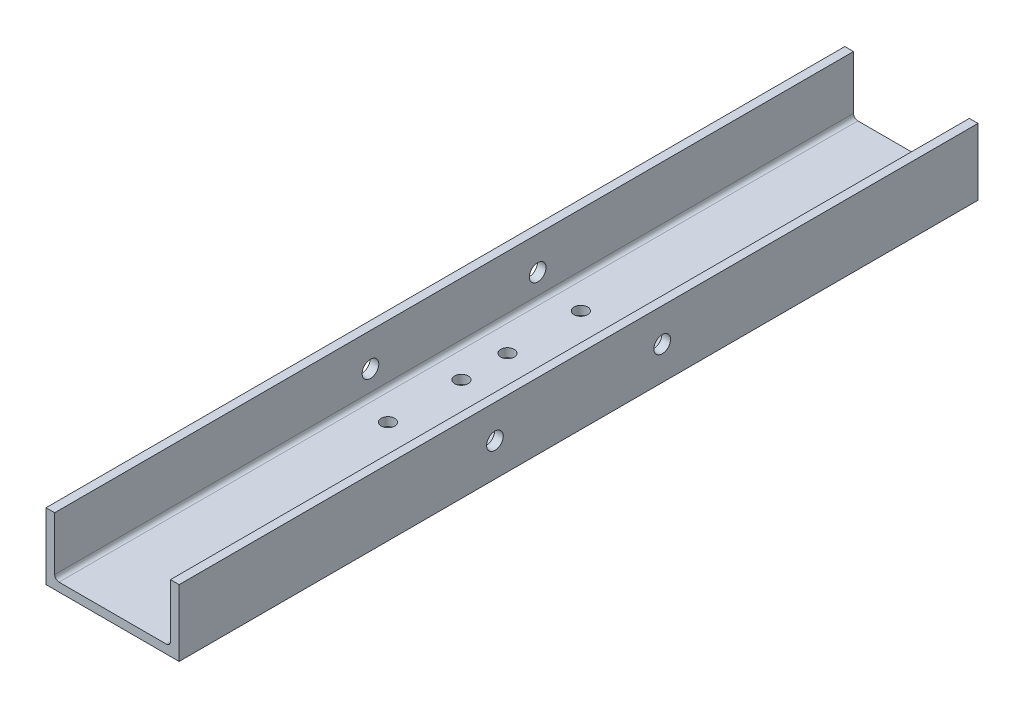
ISO-10303-21;
HEADER;
FILE_DESCRIPTION(('STEP AP214'),'2;1');
FILE_NAME('part.step','',(''),(''),'','','');
FILE_SCHEMA(('AUTOMOTIVE_DESIGN { 1 0 10303 214 1 1 1 1 }'));
ENDSEC;
DATA;
#1=APPLICATION_CONTEXT('core data for automotive mechanical design processes');
#2=APPLICATION_PROTOCOL_DEFINITION('international standard','automotive_design',2000,#1);
#3=PRODUCT_CONTEXT('',#1,'mechanical');
#4=PRODUCT('Part','Part','',(#3));
#5=PRODUCT_RELATED_PRODUCT_CATEGORY('part','',(#4));
#6=PRODUCT_DEFINITION_FORMATION('','',#4);
#7=PRODUCT_DEFINITION_CONTEXT('part definition',#1,'design');
#8=PRODUCT_DEFINITION('design','',#6,#7);
#9=PRODUCT_DEFINITION_SHAPE('','',#8);
#10=(LENGTH_UNIT() NAMED_UNIT(*) SI_UNIT(.MILLI.,.METRE.));
#11=(NAMED_UNIT(*) PLANE_ANGLE_UNIT() SI_UNIT($,.RADIAN.));
#12=(NAMED_UNIT(*) SI_UNIT($,.STERADIAN.) SOLID_ANGLE_UNIT());
#13=UNCERTAINTY_MEASURE_WITH_UNIT(LENGTH_MEASURE(1.E-05),#10,'distance_accuracy_value','');
#14=(GEOMETRIC_REPRESENTATION_CONTEXT(3) GLOBAL_UNCERTAINTY_ASSIGNED_CONTEXT((#13)) GLOBAL_UNIT_ASSIGNED_CONTEXT((#10,
#11,#12)) REPRESENTATION_CONTEXT('',''));
#15=CARTESIAN_POINT('',(0.,0.,0.));
#16=DIRECTION('',(0.,0.,1.));
#17=DIRECTION('',(1.,0.,0.));
#18=AXIS2_PLACEMENT_3D('',#15,#16,#17);
#19=CARTESIAN_POINT('',(-22.098,12.7,152.4));
#20=DIRECTION('',(0.,-1.,0.));
#21=DIRECTION('',(1.,0.,0.));
#22=AXIS2_PLACEMENT_3D('',#19,#20,#21);
#23=PLANE('',#22);
#24=DIRECTION('',(-1.,0.,0.));
#25=VECTOR('',#24,1.);
#26=CARTESIAN_POINT('',(-22.098,12.7,-152.4));
#27=LINE('',#26,#25);
#28=CARTESIAN_POINT('',(-22.098,12.7,-152.4));
#29=VERTEX_POINT('',#28);
#30=CARTESIAN_POINT('',(-25.4,12.7,-152.4));
#31=VERTEX_POINT('',#30);
#32=EDGE_CURVE('E142',#29,#31,#27,.T.);
#33=ORIENTED_EDGE('',*,*,#32,.T.);
#34=DIRECTION('',(0.,0.,-1.));
#35=VECTOR('',#34,1.);
#36=CARTESIAN_POINT('',(-25.4,12.7,152.4));
#37=LINE('',#36,#35);
#38=CARTESIAN_POINT('',(-25.4,12.7,152.4));
#39=VERTEX_POINT('',#38);
#40=EDGE_CURVE('E125',#39,#31,#37,.T.);
#41=ORIENTED_EDGE('',*,*,#40,.F.);
#42=DIRECTION('',(-1.,0.,0.));
#43=VECTOR('',#42,1.);
#44=CARTESIAN_POINT('',(-22.098,12.7,152.4));
#45=LINE('',#44,#43);
#46=CARTESIAN_POINT('',(-22.098,12.7,152.4));
#47=VERTEX_POINT('',#46);
#48=EDGE_CURVE('E131',#47,#39,#45,.T.);
#49=ORIENTED_EDGE('',*,*,#48,.F.);
#50=DIRECTION('',(0.,0.,-1.));
#51=VECTOR('',#50,1.);
#52=CARTESIAN_POINT('',(-22.098,12.7,152.4));
#53=LINE('',#52,#51);
#54=EDGE_CURVE('E245',#47,#29,#53,.T.);
#55=ORIENTED_EDGE('',*,*,#54,.T.);
#56=EDGE_LOOP('',(#33,#41,#49,#55));
#57=FACE_BOUND('',#56,.T.);
#58=ADVANCED_FACE('F43',(#57),#23,.F.);
#59=CARTESIAN_POINT('',(-25.4,12.7,152.4));
#60=DIRECTION('',(1.,0.,0.));
#61=DIRECTION('',(0.,1.,0.));
#62=AXIS2_PLACEMENT_3D('',#59,#60,#61);
#63=PLANE('',#62);
#64=CARTESIAN_POINT('',(-25.4,0.,31.91));
#65=DIRECTION('',(1.,0.,0.));
#66=DIRECTION('',(0.,1.,0.));
#67=AXIS2_PLACEMENT_3D('',#64,#65,#66);
#68=CIRCLE('',#67,3.18);
#69=CARTESIAN_POINT('',(-25.4,3.18,31.91));
#70=VERTEX_POINT('',#69);
#71=EDGE_CURVE('E183',#70,#70,#68,.T.);
#72=ORIENTED_EDGE('',*,*,#71,.T.);
#73=EDGE_LOOP('',(#72));
#74=FACE_BOUND('',#73,.T.);
#75=CARTESIAN_POINT('',(-25.4,0.,-31.91));
#76=DIRECTION('',(1.,0.,0.));
#77=DIRECTION('',(0.,1.,0.));
#78=AXIS2_PLACEMENT_3D('',#75,#76,#77);
#79=CIRCLE('',#78,3.18);
#80=CARTESIAN_POINT('',(-25.4,3.18000000000001,-31.91));
#81=VERTEX_POINT('',#80);
#82=EDGE_CURVE('E172',#81,#81,#79,.T.);
#83=ORIENTED_EDGE('',*,*,#82,.T.);
#84=EDGE_LOOP('',(#83));
#85=FACE_BOUND('',#84,.T.);
#86=DIRECTION('',(0.,-1.,0.));
#87=VECTOR('',#86,1.);
#88=CARTESIAN_POINT('',(-25.4,12.7,-152.4));
#89=LINE('',#88,#87);
#90=CARTESIAN_POINT('',(-25.4,-12.7,-152.4));
#91=VERTEX_POINT('',#90);
#92=EDGE_CURVE('E247',#31,#91,#89,.T.);
#93=ORIENTED_EDGE('',*,*,#92,.T.);
#94=DIRECTION('',(0.,0.,-1.));
#95=VECTOR('',#94,1.);
#96=CARTESIAN_POINT('',(-25.4,-12.7,152.4));
#97=LINE('',#96,#95);
#98=CARTESIAN_POINT('',(-25.4,-12.7,152.4));
#99=VERTEX_POINT('',#98);
#100=EDGE_CURVE('E128',#99,#91,#97,.T.);
#101=ORIENTED_EDGE('',*,*,#100,.F.);
#102=DIRECTION('',(0.,-1.,0.));
#103=VECTOR('',#102,1.);
#104=CARTESIAN_POINT('',(-25.4,12.7,152.4));
#105=LINE('',#104,#103);
#106=EDGE_CURVE('E121',#39,#99,#105,.T.);
#107=ORIENTED_EDGE('',*,*,#106,.F.);
#108=ORIENTED_EDGE('',*,*,#40,.T.);
#109=EDGE_LOOP('',(#93,#101,#107,#108));
#110=FACE_BOUND('',#109,.T.);
#111=ADVANCED_FACE('F123',(#74,#85,#110),#63,.F.);
#112=CARTESIAN_POINT('',(-25.4,-12.7,152.4));
#113=DIRECTION('',(0.,1.,0.));
#114=DIRECTION('',(-1.,0.,0.));
#115=AXIS2_PLACEMENT_3D('',#112,#113,#114);
#116=PLANE('',#115);
#117=CARTESIAN_POINT('',(-10.5304351416879,-12.7,36.79));
#118=DIRECTION('',(0.,1.,0.));
#119=DIRECTION('',(-1.,0.,0.));
#120=AXIS2_PLACEMENT_3D('',#117,#118,#119);
#121=CIRCLE('',#120,2.58499999999999);
#122=CARTESIAN_POINT('',(-13.1154351416879,-12.7,36.79));
#123=VERTEX_POINT('',#122);
#124=EDGE_CURVE('E231',#123,#123,#121,.T.);
#125=ORIENTED_EDGE('',*,*,#124,.T.);
#126=EDGE_LOOP('',(#125));
#127=FACE_BOUND('',#126,.T.);
#128=CARTESIAN_POINT('',(10.4695648583121,-12.7,-36.79));
#129=DIRECTION('',(0.,1.,0.));
#130=DIRECTION('',(-1.,0.,0.));
#131=AXIS2_PLACEMENT_3D('',#128,#129,#130);
#132=CIRCLE('',#131,2.58499999999999);
#133=CARTESIAN_POINT('',(7.88456485831209,-12.7,-36.79));
#134=VERTEX_POINT('',#133);
#135=EDGE_CURVE('E228',#134,#134,#132,.T.);
#136=ORIENTED_EDGE('',*,*,#135,.T.);
#137=EDGE_LOOP('',(#136));
#138=FACE_BOUND('',#137,.T.);
#139=CARTESIAN_POINT('',(-10.5304351416879,-12.7,-36.79));
#140=DIRECTION('',(0.,1.,0.));
#141=DIRECTION('',(-1.,0.,0.));
#142=AXIS2_PLACEMENT_3D('',#139,#140,#141);
#143=CIRCLE('',#142,2.58499999999999);
#144=CARTESIAN_POINT('',(-13.1154351416879,-12.7,-36.79));
#145=VERTEX_POINT('',#144);
#146=EDGE_CURVE('E225',#145,#145,#143,.T.);
#147=ORIENTED_EDGE('',*,*,#146,.T.);
#148=EDGE_LOOP('',(#147));
#149=FACE_BOUND('',#148,.T.);
#150=CARTESIAN_POINT('',(10.4695648583121,-12.7,-8.78999999999999));
#151=DIRECTION('',(0.,1.,0.));
#152=DIRECTION('',(-1.,0.,0.));
#153=AXIS2_PLACEMENT_3D('',#150,#151,#152);
#154=CIRCLE('',#153,2.58499999999999);
#155=CARTESIAN_POINT('',(7.88456485831208,-12.7,-8.78999999999999));
#156=VERTEX_POINT('',#155);
#157=EDGE_CURVE('E222',#156,#156,#154,.T.);
#158=ORIENTED_EDGE('',*,*,#157,.T.);
#159=EDGE_LOOP('',(#158));
#160=FACE_BOUND('',#159,.T.);
#161=CARTESIAN_POINT('',(10.4695648583121,-12.7,36.79));
#162=DIRECTION('',(0.,1.,0.));
#163=DIRECTION('',(-1.,0.,0.));
#164=AXIS2_PLACEMENT_3D('',#161,#162,#163);
#165=CIRCLE('',#164,2.58499999999999);
#166=CARTESIAN_POINT('',(7.88456485831209,-12.7,36.79));
#167=VERTEX_POINT('',#166);
#168=EDGE_CURVE('E219',#167,#167,#165,.T.);
#169=ORIENTED_EDGE('',*,*,#168,.T.);
#170=EDGE_LOOP('',(#169));
#171=FACE_BOUND('',#170,.T.);
#172=CARTESIAN_POINT('',(10.4695648583121,-12.7,8.78999999999999));
#173=DIRECTION('',(0.,1.,0.));
#174=DIRECTION('',(-1.,0.,0.));
#175=AXIS2_PLACEMENT_3D('',#172,#173,#174);
#176=CIRCLE('',#175,2.58499999999999);
#177=CARTESIAN_POINT('',(7.88456485831208,-12.7,8.78999999999999));
#178=VERTEX_POINT('',#177);
#179=EDGE_CURVE('E216',#178,#178,#176,.T.);
#180=ORIENTED_EDGE('',*,*,#179,.T.);
#181=EDGE_LOOP('',(#180));
#182=FACE_BOUND('',#181,.T.);
#183=CARTESIAN_POINT('',(-10.5304351416879,-12.7,8.79));
#184=DIRECTION('',(0.,1.,0.));
#185=DIRECTION('',(-1.,0.,0.));
#186=AXIS2_PLACEMENT_3D('',#183,#184,#185);
#187=CIRCLE('',#186,2.58499999999998);
#188=CARTESIAN_POINT('',(-13.1154351416879,-12.7,8.79));
#189=VERTEX_POINT('',#188);
#190=EDGE_CURVE('E213',#189,#189,#187,.T.);
#191=ORIENTED_EDGE('',*,*,#190,.T.);
#192=EDGE_LOOP('',(#191));
#193=FACE_BOUND('',#192,.T.);
#194=CARTESIAN_POINT('',(-10.5304351416879,-12.7,-8.79));
#195=DIRECTION('',(0.,1.,0.));
#196=DIRECTION('',(-1.,0.,0.));
#197=AXIS2_PLACEMENT_3D('',#194,#195,#196);
#198=CIRCLE('',#197,2.58499999999998);
#199=CARTESIAN_POINT('',(-13.1154351416879,-12.7,-8.79));
#200=VERTEX_POINT('',#199);
#201=EDGE_CURVE('E210',#200,#200,#198,.T.);
#202=ORIENTED_EDGE('',*,*,#201,.T.);
#203=EDGE_LOOP('',(#202));
#204=FACE_BOUND('',#203,.T.);
#205=DIRECTION('',(1.,0.,0.));
#206=VECTOR('',#205,1.);
#207=CARTESIAN_POINT('',(-25.4,-12.7,-152.4));
#208=LINE('',#207,#206);
#209=CARTESIAN_POINT('',(25.4,-12.7,-152.4));
#210=VERTEX_POINT('',#209);
#211=EDGE_CURVE('E249',#91,#210,#208,.T.);
#212=ORIENTED_EDGE('',*,*,#211,.T.);
#213=DIRECTION('',(0.,0.,-1.));
#214=VECTOR('',#213,1.);
#215=CARTESIAN_POINT('',(25.4,-12.7,152.4));
#216=LINE('',#215,#214);
#217=CARTESIAN_POINT('',(25.4,-12.7,152.4));
#218=VERTEX_POINT('',#217);
#219=EDGE_CURVE('E147',#218,#210,#216,.T.);
#220=ORIENTED_EDGE('',*,*,#219,.F.);
#221=DIRECTION('',(1.,0.,0.));
#222=VECTOR('',#221,1.);
#223=CARTESIAN_POINT('',(-25.4,-12.7,152.4));
#224=LINE('',#223,#222);
#225=EDGE_CURVE('E130',#99,#218,#224,.T.);
#226=ORIENTED_EDGE('',*,*,#225,.F.);
#227=ORIENTED_EDGE('',*,*,#100,.T.);
#228=EDGE_LOOP('',(#212,#220,#226,#227));
#229=FACE_BOUND('',#228,.T.);
#230=ADVANCED_FACE('F316',(#127,#138,#149,#160,#171,#182,#193,#204,#229),#116,.F.);
#231=CARTESIAN_POINT('',(25.4,-12.7,152.4));
#232=DIRECTION('',(-1.,0.,0.));
#233=DIRECTION('',(0.,-1.,0.));
#234=AXIS2_PLACEMENT_3D('',#231,#232,#233);
#235=PLANE('',#234);
#236=CARTESIAN_POINT('',(25.4,0.,31.91));
#237=DIRECTION('',(-1.,0.,0.));
#238=DIRECTION('',(0.,-1.,0.));
#239=AXIS2_PLACEMENT_3D('',#236,#237,#238);
#240=CIRCLE('',#239,3.18);
#241=CARTESIAN_POINT('',(25.4,-3.18000000000001,31.91));
#242=VERTEX_POINT('',#241);
#243=EDGE_CURVE('E180',#242,#242,#240,.T.);
#244=ORIENTED_EDGE('',*,*,#243,.T.);
#245=EDGE_LOOP('',(#244));
#246=FACE_BOUND('',#245,.T.);
#247=CARTESIAN_POINT('',(25.4,0.,-31.91));
#248=DIRECTION('',(-1.,0.,0.));
#249=DIRECTION('',(0.,-1.,0.));
#250=AXIS2_PLACEMENT_3D('',#247,#248,#249);
#251=CIRCLE('',#250,3.18);
#252=CARTESIAN_POINT('',(25.4,-3.18,-31.91));
#253=VERTEX_POINT('',#252);
#254=EDGE_CURVE('E167',#253,#253,#251,.T.);
#255=ORIENTED_EDGE('',*,*,#254,.T.);
#256=EDGE_LOOP('',(#255));
#257=FACE_BOUND('',#256,.T.);
#258=DIRECTION('',(0.,1.,0.));
#259=VECTOR('',#258,1.);
#260=CARTESIAN_POINT('',(25.4,-12.7,-152.4));
#261=LINE('',#260,#259);
#262=CARTESIAN_POINT('',(25.4,12.7,-152.4));
#263=VERTEX_POINT('',#262);
#264=EDGE_CURVE('E251',#210,#263,#261,.T.);
#265=ORIENTED_EDGE('',*,*,#264,.T.);
#266=DIRECTION('',(0.,0.,-1.));
#267=VECTOR('',#266,1.);
#268=CARTESIAN_POINT('',(25.4,12.7,152.4));
#269=LINE('',#268,#267);
#270=CARTESIAN_POINT('',(25.4,12.7,152.4));
#271=VERTEX_POINT('',#270);
#272=EDGE_CURVE('E266',#271,#263,#269,.T.);
#273=ORIENTED_EDGE('',*,*,#272,.F.);
#274=DIRECTION('',(0.,1.,0.));
#275=VECTOR('',#274,1.);
#276=CARTESIAN_POINT('',(25.4,-12.7,152.4));
#277=LINE('',#276,#275);
#278=EDGE_CURVE('E235',#218,#271,#277,.T.);
#279=ORIENTED_EDGE('',*,*,#278,.F.);
#280=ORIENTED_EDGE('',*,*,#219,.T.);
#281=EDGE_LOOP('',(#265,#273,#279,#280));
#282=FACE_BOUND('',#281,.T.);
#283=ADVANCED_FACE('F273',(#246,#257,#282),#235,.F.);
#284=CARTESIAN_POINT('',(25.4,12.7,152.4));
#285=DIRECTION('',(0.,-1.,0.));
#286=DIRECTION('',(1.,0.,0.));
#287=AXIS2_PLACEMENT_3D('',#284,#285,#286);
#288=PLANE('',#287);
#289=DIRECTION('',(-1.,0.,0.));
#290=VECTOR('',#289,1.);
#291=CARTESIAN_POINT('',(25.4,12.7,-152.4));
#292=LINE('',#291,#290);
#293=CARTESIAN_POINT('',(22.098,12.7,-152.4));
#294=VERTEX_POINT('',#293);
#295=EDGE_CURVE('E253',#263,#294,#292,.T.);
#296=ORIENTED_EDGE('',*,*,#295,.T.);
#297=DIRECTION('',(0.,0.,-1.));
#298=VECTOR('',#297,1.);
#299=CARTESIAN_POINT('',(22.098,12.7,152.4));
#300=LINE('',#299,#298);
#301=CARTESIAN_POINT('',(22.098,12.7,152.4));
#302=VERTEX_POINT('',#301);
#303=EDGE_CURVE('E263',#302,#294,#300,.T.);
#304=ORIENTED_EDGE('',*,*,#303,.F.);
#305=DIRECTION('',(-1.,0.,0.));
#306=VECTOR('',#305,1.);
#307=CARTESIAN_POINT('',(25.4,12.7,152.4));
#308=LINE('',#307,#306);
#309=EDGE_CURVE('E237',#271,#302,#308,.T.);
#310=ORIENTED_EDGE('',*,*,#309,.F.);
#311=ORIENTED_EDGE('',*,*,#272,.T.);
#312=EDGE_LOOP('',(#296,#304,#310,#311));
#313=FACE_BOUND('',#312,.T.);
#314=ADVANCED_FACE('F283',(#313),#288,.F.);
#315=CARTESIAN_POINT('',(22.098,12.7,152.4));
#316=DIRECTION('',(1.,0.,0.));
#317=DIRECTION('',(0.,1.,0.));
#318=AXIS2_PLACEMENT_3D('',#315,#316,#317);
#319=PLANE('',#318);
#320=CARTESIAN_POINT('',(22.098,0.,31.91));
#321=DIRECTION('',(1.,0.,0.));
#322=DIRECTION('',(0.,1.,0.));
#323=AXIS2_PLACEMENT_3D('',#320,#321,#322);
#324=CIRCLE('',#323,3.18);
#325=CARTESIAN_POINT('',(22.098,3.18,31.91));
#326=VERTEX_POINT('',#325);
#327=EDGE_CURVE('E177',#326,#326,#324,.T.);
#328=ORIENTED_EDGE('',*,*,#327,.T.);
#329=EDGE_LOOP('',(#328));
#330=FACE_BOUND('',#329,.T.);
#331=CARTESIAN_POINT('',(22.098,0.,-31.91));
#332=DIRECTION('',(1.,0.,0.));
#333=DIRECTION('',(0.,1.,0.));
#334=AXIS2_PLACEMENT_3D('',#331,#332,#333);
#335=CIRCLE('',#334,3.18);
#336=CARTESIAN_POINT('',(22.098,3.18000000000001,-31.91));
#337=VERTEX_POINT('',#336);
#338=EDGE_CURVE('E163',#337,#337,#335,.T.);
#339=ORIENTED_EDGE('',*,*,#338,.T.);
#340=EDGE_LOOP('',(#339));
#341=FACE_BOUND('',#340,.T.);
#342=DIRECTION('',(0.,-1.,0.));
#343=VECTOR('',#342,1.);
#344=CARTESIAN_POINT('',(22.098,12.7,-152.4));
#345=LINE('',#344,#343);
#346=CARTESIAN_POINT('',(22.098,-7.747,-152.4));
#347=VERTEX_POINT('',#346);
#348=EDGE_CURVE('E255',#294,#347,#345,.T.);
#349=ORIENTED_EDGE('',*,*,#348,.T.);
#350=DIRECTION('',(0.,0.,-1.));
#351=VECTOR('',#350,1.);
#352=CARTESIAN_POINT('',(22.098,-7.747,152.4));
#353=LINE('',#352,#351);
#354=CARTESIAN_POINT('',(22.098,-7.747,152.4));
#355=VERTEX_POINT('',#354);
#356=EDGE_CURVE('E153',#347,#355,#353,.F.);
#357=ORIENTED_EDGE('',*,*,#356,.T.);
#358=DIRECTION('',(0.,-1.,0.));
#359=VECTOR('',#358,1.);
#360=CARTESIAN_POINT('',(22.098,12.7,152.4));
#361=LINE('',#360,#359);
#362=EDGE_CURVE('E239',#302,#355,#361,.T.);
#363=ORIENTED_EDGE('',*,*,#362,.F.);
#364=ORIENTED_EDGE('',*,*,#303,.T.);
#365=EDGE_LOOP('',(#349,#357,#363,#364));
#366=FACE_BOUND('',#365,.T.);
#367=ADVANCED_FACE('F287',(#330,#341,#366),#319,.F.);
#368=CARTESIAN_POINT('',(22.098,-9.398,152.4));
#369=DIRECTION('',(0.,-1.,0.));
#370=DIRECTION('',(1.,0.,0.));
#371=AXIS2_PLACEMENT_3D('',#368,#369,#370);
#372=PLANE('',#371);
#373=CARTESIAN_POINT('',(-10.5304351416879,-9.39800000000001,36.79));
#374=DIRECTION('',(0.,1.,0.));
#375=DIRECTION('',(1.,0.,0.));
#376=AXIS2_PLACEMENT_3D('',#373,#374,#375);
#377=CIRCLE('',#376,2.58499999999999);
#378=CARTESIAN_POINT('',(-7.94543514168796,-9.39800000000001,36.79));
#379=VERTEX_POINT('',#378);
#380=EDGE_CURVE('E190',#379,#379,#377,.T.);
#381=ORIENTED_EDGE('',*,*,#380,.F.);
#382=EDGE_LOOP('',(#381));
#383=FACE_BOUND('',#382,.T.);
#384=CARTESIAN_POINT('',(10.4695648583121,-9.398,-36.79));
#385=DIRECTION('',(0.,1.,0.));
#386=DIRECTION('',(1.,0.,0.));
#387=AXIS2_PLACEMENT_3D('',#384,#385,#386);
#388=CIRCLE('',#387,2.58499999999999);
#389=CARTESIAN_POINT('',(13.0545648583121,-9.398,-36.79));
#390=VERTEX_POINT('',#389);
#391=EDGE_CURVE('E196',#390,#390,#388,.T.);
#392=ORIENTED_EDGE('',*,*,#391,.F.);
#393=EDGE_LOOP('',(#392));
#394=FACE_BOUND('',#393,.T.);
#395=CARTESIAN_POINT('',(-10.5304351416879,-9.39800000000001,-36.79));
#396=DIRECTION('',(0.,1.,0.));
#397=DIRECTION('',(-1.,0.,0.));
#398=AXIS2_PLACEMENT_3D('',#395,#396,#397);
#399=CIRCLE('',#398,2.58499999999999);
#400=CARTESIAN_POINT('',(-13.1154351416879,-9.39800000000001,-36.79));
#401=VERTEX_POINT('',#400);
#402=EDGE_CURVE('E199',#401,#401,#399,.T.);
#403=ORIENTED_EDGE('',*,*,#402,.F.);
#404=EDGE_LOOP('',(#403));
#405=FACE_BOUND('',#404,.T.);
#406=CARTESIAN_POINT('',(10.4695648583121,-9.398,-8.78999999999999));
#407=DIRECTION('',(0.,1.,0.));
#408=DIRECTION('',(1.,0.,0.));
#409=AXIS2_PLACEMENT_3D('',#406,#407,#408);
#410=CIRCLE('',#409,2.58499999999999);
#411=CARTESIAN_POINT('',(13.0545648583121,-9.398,-8.78999999999999));
#412=VERTEX_POINT('',#411);
#413=EDGE_CURVE('E202',#412,#412,#410,.T.);
#414=ORIENTED_EDGE('',*,*,#413,.F.);
#415=EDGE_LOOP('',(#414));
#416=FACE_BOUND('',#415,.T.);
#417=CARTESIAN_POINT('',(10.4695648583121,-9.398,36.79));
#418=DIRECTION('',(0.,1.,0.));
#419=DIRECTION('',(-1.,0.,0.));
#420=AXIS2_PLACEMENT_3D('',#417,#418,#419);
#421=CIRCLE('',#420,2.58499999999999);
#422=CARTESIAN_POINT('',(7.88456485831209,-9.398,36.79));
#423=VERTEX_POINT('',#422);
#424=EDGE_CURVE('E187',#423,#423,#421,.T.);
#425=ORIENTED_EDGE('',*,*,#424,.F.);
#426=EDGE_LOOP('',(#425));
#427=FACE_BOUND('',#426,.T.);
#428=CARTESIAN_POINT('',(10.4695648583121,-9.398,8.78999999999999));
#429=DIRECTION('',(0.,1.,0.));
#430=DIRECTION('',(-1.,0.,0.));
#431=AXIS2_PLACEMENT_3D('',#428,#429,#430);
#432=CIRCLE('',#431,2.58499999999999);
#433=CARTESIAN_POINT('',(7.88456485831208,-9.398,8.78999999999999));
#434=VERTEX_POINT('',#433);
#435=EDGE_CURVE('E191',#434,#434,#432,.T.);
#436=ORIENTED_EDGE('',*,*,#435,.F.);
#437=EDGE_LOOP('',(#436));
#438=FACE_BOUND('',#437,.T.);
#439=CARTESIAN_POINT('',(-10.5304351416879,-9.39800000000001,8.79));
#440=DIRECTION('',(0.,1.,0.));
#441=DIRECTION('',(1.,0.,0.));
#442=AXIS2_PLACEMENT_3D('',#439,#440,#441);
#443=CIRCLE('',#442,2.58499999999998);
#444=CARTESIAN_POINT('',(-7.94543514168796,-9.39800000000001,8.79));
#445=VERTEX_POINT('',#444);
#446=EDGE_CURVE('E186',#445,#445,#443,.T.);
#447=ORIENTED_EDGE('',*,*,#446,.F.);
#448=EDGE_LOOP('',(#447));
#449=FACE_BOUND('',#448,.T.);
#450=CARTESIAN_POINT('',(-10.5304351416879,-9.39800000000001,-8.79));
#451=DIRECTION('',(0.,1.,0.));
#452=DIRECTION('',(-1.,0.,0.));
#453=AXIS2_PLACEMENT_3D('',#450,#451,#452);
#454=CIRCLE('',#453,2.58499999999998);
#455=CARTESIAN_POINT('',(-13.1154351416879,-9.39800000000001,-8.79));
#456=VERTEX_POINT('',#455);
#457=EDGE_CURVE('E205',#456,#456,#454,.T.);
#458=ORIENTED_EDGE('',*,*,#457,.F.);
#459=EDGE_LOOP('',(#458));
#460=FACE_BOUND('',#459,.T.);
#461=DIRECTION('',(-1.,0.,0.));
#462=VECTOR('',#461,1.);
#463=CARTESIAN_POINT('',(22.098,-9.398,152.4));
#464=LINE('',#463,#462);
#465=CARTESIAN_POINT('',(20.447,-9.398,152.4));
#466=VERTEX_POINT('',#465);
#467=CARTESIAN_POINT('',(-20.447,-9.39800000000001,152.4));
#468=VERTEX_POINT('',#467);
#469=EDGE_CURVE('E242',#466,#468,#464,.T.);
#470=ORIENTED_EDGE('',*,*,#469,.F.);
#471=DIRECTION('',(0.,0.,-1.));
#472=VECTOR('',#471,1.);
#473=CARTESIAN_POINT('',(20.447,-9.398,-152.4));
#474=LINE('',#473,#472);
#475=CARTESIAN_POINT('',(20.447,-9.398,-152.4));
#476=VERTEX_POINT('',#475);
#477=EDGE_CURVE('E145',#466,#476,#474,.T.);
#478=ORIENTED_EDGE('',*,*,#477,.T.);
#479=DIRECTION('',(-1.,0.,0.));
#480=VECTOR('',#479,1.);
#481=CARTESIAN_POINT('',(22.098,-9.398,-152.4));
#482=LINE('',#481,#480);
#483=CARTESIAN_POINT('',(-20.447,-9.39800000000001,-152.4));
#484=VERTEX_POINT('',#483);
#485=EDGE_CURVE('E258',#476,#484,#482,.T.);
#486=ORIENTED_EDGE('',*,*,#485,.T.);
#487=DIRECTION('',(0.,0.,-1.));
#488=VECTOR('',#487,1.);
#489=CARTESIAN_POINT('',(-20.447,-9.39800000000001,152.4));
#490=LINE('',#489,#488);
#491=EDGE_CURVE('E143',#484,#468,#490,.F.);
#492=ORIENTED_EDGE('',*,*,#491,.T.);
#493=EDGE_LOOP('',(#470,#478,#486,#492));
#494=FACE_BOUND('',#493,.T.);
#495=ADVANCED_FACE('F296',(#383,#394,#405,#416,#427,#438,#449,#460,#494),#372,.F.);
#496=CARTESIAN_POINT('',(-22.098,-9.39800000000001,152.4));
#497=DIRECTION('',(-1.,0.,0.));
#498=DIRECTION('',(0.,-1.,0.));
#499=AXIS2_PLACEMENT_3D('',#496,#497,#498);
#500=PLANE('',#499);
#501=CARTESIAN_POINT('',(-22.098,0.,31.91));
#502=DIRECTION('',(-1.,0.,0.));
#503=DIRECTION('',(0.,-1.,0.));
#504=AXIS2_PLACEMENT_3D('',#501,#502,#503);
#505=CIRCLE('',#504,3.18);
#506=CARTESIAN_POINT('',(-22.098,-3.18000000000001,31.91));
#507=VERTEX_POINT('',#506);
#508=EDGE_CURVE('E47',#507,#507,#505,.T.);
#509=ORIENTED_EDGE('',*,*,#508,.T.);
#510=EDGE_LOOP('',(#509));
#511=FACE_BOUND('',#510,.T.);
#512=CARTESIAN_POINT('',(-22.098,0.,-31.91));
#513=DIRECTION('',(-1.,0.,0.));
#514=DIRECTION('',(0.,-1.,0.));
#515=AXIS2_PLACEMENT_3D('',#512,#513,#514);
#516=CIRCLE('',#515,3.18);
#517=CARTESIAN_POINT('',(-22.098,-3.18,-31.91));
#518=VERTEX_POINT('',#517);
#519=EDGE_CURVE('E161',#518,#518,#516,.T.);
#520=ORIENTED_EDGE('',*,*,#519,.T.);
#521=EDGE_LOOP('',(#520));
#522=FACE_BOUND('',#521,.T.);
#523=DIRECTION('',(0.,1.,0.));
#524=VECTOR('',#523,1.);
#525=CARTESIAN_POINT('',(-22.098,-9.39800000000001,152.4));
#526=LINE('',#525,#524);
#527=CARTESIAN_POINT('',(-22.098,-7.74700000000001,152.4));
#528=VERTEX_POINT('',#527);
#529=EDGE_CURVE('E135',#528,#47,#526,.T.);
#530=ORIENTED_EDGE('',*,*,#529,.F.);
#531=DIRECTION('',(0.,0.,-1.));
#532=VECTOR('',#531,1.);
#533=CARTESIAN_POINT('',(-22.098,-7.74700000000001,-152.4));
#534=LINE('',#533,#532);
#535=CARTESIAN_POINT('',(-22.098,-7.74700000000001,-152.4));
#536=VERTEX_POINT('',#535);
#537=EDGE_CURVE('E155',#528,#536,#534,.T.);
#538=ORIENTED_EDGE('',*,*,#537,.T.);
#539=DIRECTION('',(0.,1.,0.));
#540=VECTOR('',#539,1.);
#541=CARTESIAN_POINT('',(-22.098,-9.39800000000001,-152.4));
#542=LINE('',#541,#540);
#543=EDGE_CURVE('E139',#536,#29,#542,.T.);
#544=ORIENTED_EDGE('',*,*,#543,.T.);
#545=ORIENTED_EDGE('',*,*,#54,.F.);
#546=EDGE_LOOP('',(#530,#538,#544,#545));
#547=FACE_BOUND('',#546,.T.);
#548=ADVANCED_FACE('F299',(#511,#522,#547),#500,.F.);
#549=CARTESIAN_POINT('',(0.,0.,152.4));
#550=DIRECTION('',(0.,0.,1.));
#551=DIRECTION('',(1.,0.,0.));
#552=AXIS2_PLACEMENT_3D('',#549,#550,#551);
#553=PLANE('',#552);
#554=ORIENTED_EDGE('',*,*,#48,.T.);
#555=ORIENTED_EDGE('',*,*,#106,.T.);
#556=ORIENTED_EDGE('',*,*,#225,.T.);
#557=ORIENTED_EDGE('',*,*,#278,.T.);
#558=ORIENTED_EDGE('',*,*,#309,.T.);
#559=ORIENTED_EDGE('',*,*,#362,.T.);
#560=CARTESIAN_POINT('',(20.447,-7.747,152.4));
#561=DIRECTION('',(0.,0.,1.));
#562=DIRECTION('',(1.,0.,0.));
#563=AXIS2_PLACEMENT_3D('',#560,#561,#562);
#564=CIRCLE('',#563,1.651);
#565=EDGE_CURVE('E159',#355,#466,#564,.F.);
#566=ORIENTED_EDGE('',*,*,#565,.T.);
#567=ORIENTED_EDGE('',*,*,#469,.T.);
#568=CARTESIAN_POINT('',(-20.447,-7.74700000000001,152.4));
#569=DIRECTION('',(0.,0.,1.));
#570=DIRECTION('',(1.,0.,0.));
#571=AXIS2_PLACEMENT_3D('',#568,#569,#570);
#572=CIRCLE('',#571,1.651);
#573=EDGE_CURVE('E11',#468,#528,#572,.F.);
#574=ORIENTED_EDGE('',*,*,#573,.T.);
#575=ORIENTED_EDGE('',*,*,#529,.T.);
#576=EDGE_LOOP('',(#554,#555,#556,#557,#558,#559,#566,#567,#574,#575));
#577=FACE_BOUND('',#576,.T.);
#578=ADVANCED_FACE('F134',(#577),#553,.T.);
#579=CARTESIAN_POINT('',(0.,0.,-152.4));
#580=DIRECTION('',(0.,0.,1.));
#581=DIRECTION('',(1.,0.,0.));
#582=AXIS2_PLACEMENT_3D('',#579,#580,#581);
#583=PLANE('',#582);
#584=ORIENTED_EDGE('',*,*,#32,.F.);
#585=ORIENTED_EDGE('',*,*,#543,.F.);
#586=CARTESIAN_POINT('',(-20.447,-7.74700000000001,-152.4));
#587=DIRECTION('',(0.,0.,1.));
#588=DIRECTION('',(1.,0.,0.));
#589=AXIS2_PLACEMENT_3D('',#586,#587,#588);
#590=CIRCLE('',#589,1.651);
#591=EDGE_CURVE('E52',#536,#484,#590,.T.);
#592=ORIENTED_EDGE('',*,*,#591,.T.);
#593=ORIENTED_EDGE('',*,*,#485,.F.);
#594=CARTESIAN_POINT('',(20.447,-7.747,-152.4));
#595=DIRECTION('',(0.,0.,1.));
#596=DIRECTION('',(1.,0.,0.));
#597=AXIS2_PLACEMENT_3D('',#594,#595,#596);
#598=CIRCLE('',#597,1.651);
#599=EDGE_CURVE('E157',#476,#347,#598,.T.);
#600=ORIENTED_EDGE('',*,*,#599,.T.);
#601=ORIENTED_EDGE('',*,*,#348,.F.);
#602=ORIENTED_EDGE('',*,*,#295,.F.);
#603=ORIENTED_EDGE('',*,*,#264,.F.);
#604=ORIENTED_EDGE('',*,*,#211,.F.);
#605=ORIENTED_EDGE('',*,*,#92,.F.);
#606=EDGE_LOOP('',(#584,#585,#592,#593,#600,#601,#602,#603,#604,#605));
#607=FACE_BOUND('',#606,.T.);
#608=ADVANCED_FACE('F279',(#607),#583,.F.);
#609=CARTESIAN_POINT('',(20.447,-7.747,152.4));
#610=DIRECTION('',(0.,0.,1.));
#611=DIRECTION('',(1.,0.,0.));
#612=AXIS2_PLACEMENT_3D('',#609,#610,#611);
#613=CYLINDRICAL_SURFACE('',#612,1.651);
#614=ORIENTED_EDGE('',*,*,#565,.F.);
#615=ORIENTED_EDGE('',*,*,#356,.F.);
#616=ORIENTED_EDGE('',*,*,#599,.F.);
#617=ORIENTED_EDGE('',*,*,#477,.F.);
#618=EDGE_LOOP('',(#614,#615,#616,#617));
#619=FACE_BOUND('',#618,.T.);
#620=ADVANCED_FACE('F293',(#619),#613,.F.);
#621=CARTESIAN_POINT('',(-20.447,-7.74700000000001,152.4));
#622=DIRECTION('',(0.,0.,1.));
#623=DIRECTION('',(1.,0.,0.));
#624=AXIS2_PLACEMENT_3D('',#621,#622,#623);
#625=CYLINDRICAL_SURFACE('',#624,1.651);
#626=ORIENTED_EDGE('',*,*,#573,.F.);
#627=ORIENTED_EDGE('',*,*,#491,.F.);
#628=ORIENTED_EDGE('',*,*,#591,.F.);
#629=ORIENTED_EDGE('',*,*,#537,.F.);
#630=EDGE_LOOP('',(#626,#627,#628,#629));
#631=FACE_BOUND('',#630,.T.);
#632=ADVANCED_FACE('F45',(#631),#625,.F.);
#633=CARTESIAN_POINT('',(-10.5304351416879,-19.398,-8.79));
#634=DIRECTION('',(0.,1.,0.));
#635=DIRECTION('',(-1.,0.,0.));
#636=AXIS2_PLACEMENT_3D('',#633,#634,#635);
#637=CYLINDRICAL_SURFACE('',#636,2.58499999999998);
#638=ORIENTED_EDGE('',*,*,#457,.T.);
#639=EDGE_LOOP('',(#638));
#640=FACE_BOUND('',#639,.T.);
#641=ORIENTED_EDGE('',*,*,#201,.F.);
#642=EDGE_LOOP('',(#641));
#643=FACE_BOUND('',#642,.T.);
#644=ADVANCED_FACE('F301',(#640,#643),#637,.F.);
#645=CARTESIAN_POINT('',(-10.5304351416879,-19.398,8.79));
#646=DIRECTION('',(0.,1.,0.));
#647=DIRECTION('',(-1.,0.,0.));
#648=AXIS2_PLACEMENT_3D('',#645,#646,#647);
#649=CYLINDRICAL_SURFACE('',#648,2.58499999999998);
#650=ORIENTED_EDGE('',*,*,#446,.T.);
#651=EDGE_LOOP('',(#650));
#652=FACE_BOUND('',#651,.T.);
#653=ORIENTED_EDGE('',*,*,#190,.F.);
#654=EDGE_LOOP('',(#653));
#655=FACE_BOUND('',#654,.T.);
#656=ADVANCED_FACE('F307',(#652,#655),#649,.F.);
#657=CARTESIAN_POINT('',(10.4695648583121,-19.398,8.78999999999999));
#658=DIRECTION('',(0.,1.,0.));
#659=DIRECTION('',(-1.,0.,0.));
#660=AXIS2_PLACEMENT_3D('',#657,#658,#659);
#661=CYLINDRICAL_SURFACE('',#660,2.58499999999999);
#662=ORIENTED_EDGE('',*,*,#435,.T.);
#663=EDGE_LOOP('',(#662));
#664=FACE_BOUND('',#663,.T.);
#665=ORIENTED_EDGE('',*,*,#179,.F.);
#666=EDGE_LOOP('',(#665));
#667=FACE_BOUND('',#666,.T.);
#668=ADVANCED_FACE('F359',(#664,#667),#661,.F.);
#669=CARTESIAN_POINT('',(10.4695648583121,-19.398,36.79));
#670=DIRECTION('',(0.,1.,0.));
#671=DIRECTION('',(-1.,0.,0.));
#672=AXIS2_PLACEMENT_3D('',#669,#670,#671);
#673=CYLINDRICAL_SURFACE('',#672,2.58499999999999);
#674=ORIENTED_EDGE('',*,*,#424,.T.);
#675=EDGE_LOOP('',(#674));
#676=FACE_BOUND('',#675,.T.);
#677=ORIENTED_EDGE('',*,*,#168,.F.);
#678=EDGE_LOOP('',(#677));
#679=FACE_BOUND('',#678,.T.);
#680=ADVANCED_FACE('F347',(#676,#679),#673,.F.);
#681=CARTESIAN_POINT('',(10.4695648583121,-19.398,-8.78999999999999));
#682=DIRECTION('',(0.,1.,0.));
#683=DIRECTION('',(-1.,0.,0.));
#684=AXIS2_PLACEMENT_3D('',#681,#682,#683);
#685=CYLINDRICAL_SURFACE('',#684,2.58499999999999);
#686=ORIENTED_EDGE('',*,*,#413,.T.);
#687=EDGE_LOOP('',(#686));
#688=FACE_BOUND('',#687,.T.);
#689=ORIENTED_EDGE('',*,*,#157,.F.);
#690=EDGE_LOOP('',(#689));
#691=FACE_BOUND('',#690,.T.);
#692=ADVANCED_FACE('F343',(#688,#691),#685,.F.);
#693=CARTESIAN_POINT('',(-10.5304351416879,-19.398,-36.79));
#694=DIRECTION('',(0.,1.,0.));
#695=DIRECTION('',(-1.,0.,0.));
#696=AXIS2_PLACEMENT_3D('',#693,#694,#695);
#697=CYLINDRICAL_SURFACE('',#696,2.58499999999999);
#698=ORIENTED_EDGE('',*,*,#402,.T.);
#699=EDGE_LOOP('',(#698));
#700=FACE_BOUND('',#699,.T.);
#701=ORIENTED_EDGE('',*,*,#146,.F.);
#702=EDGE_LOOP('',(#701));
#703=FACE_BOUND('',#702,.T.);
#704=ADVANCED_FACE('F339',(#700,#703),#697,.F.);
#705=CARTESIAN_POINT('',(10.4695648583121,-19.398,-36.79));
#706=DIRECTION('',(0.,1.,0.));
#707=DIRECTION('',(-1.,0.,0.));
#708=AXIS2_PLACEMENT_3D('',#705,#706,#707);
#709=CYLINDRICAL_SURFACE('',#708,2.58499999999999);
#710=ORIENTED_EDGE('',*,*,#391,.T.);
#711=EDGE_LOOP('',(#710));
#712=FACE_BOUND('',#711,.T.);
#713=ORIENTED_EDGE('',*,*,#135,.F.);
#714=EDGE_LOOP('',(#713));
#715=FACE_BOUND('',#714,.T.);
#716=ADVANCED_FACE('F342',(#712,#715),#709,.F.);
#717=CARTESIAN_POINT('',(-10.5304351416879,-19.398,36.79));
#718=DIRECTION('',(0.,1.,0.));
#719=DIRECTION('',(-1.,0.,0.));
#720=AXIS2_PLACEMENT_3D('',#717,#718,#719);
#721=CYLINDRICAL_SURFACE('',#720,2.58499999999999);
#722=ORIENTED_EDGE('',*,*,#380,.T.);
#723=EDGE_LOOP('',(#722));
#724=FACE_BOUND('',#723,.T.);
#725=ORIENTED_EDGE('',*,*,#124,.F.);
#726=EDGE_LOOP('',(#725));
#727=FACE_BOUND('',#726,.T.);
#728=ADVANCED_FACE('F349',(#724,#727),#721,.F.);
#729=CARTESIAN_POINT('',(-30.,0.,-31.91));
#730=DIRECTION('',(1.,0.,0.));
#731=DIRECTION('',(0.,0.,-1.));
#732=AXIS2_PLACEMENT_3D('',#729,#730,#731);
#733=CYLINDRICAL_SURFACE('',#732,3.18);
#734=ORIENTED_EDGE('',*,*,#519,.F.);
#735=EDGE_LOOP('',(#734));
#736=FACE_BOUND('',#735,.T.);
#737=ORIENTED_EDGE('',*,*,#82,.F.);
#738=EDGE_LOOP('',(#737));
#739=FACE_BOUND('',#738,.T.);
#740=ADVANCED_FACE('F352',(#736,#739),#733,.F.);
#741=CARTESIAN_POINT('',(-30.,0.,31.91));
#742=DIRECTION('',(1.,0.,0.));
#743=DIRECTION('',(0.,0.,-1.));
#744=AXIS2_PLACEMENT_3D('',#741,#742,#743);
#745=CYLINDRICAL_SURFACE('',#744,3.18);
#746=ORIENTED_EDGE('',*,*,#508,.F.);
#747=EDGE_LOOP('',(#746));
#748=FACE_BOUND('',#747,.T.);
#749=ORIENTED_EDGE('',*,*,#71,.F.);
#750=EDGE_LOOP('',(#749));
#751=FACE_BOUND('',#750,.T.);
#752=ADVANCED_FACE('F369',(#748,#751),#745,.F.);
#753=ORIENTED_EDGE('',*,*,#338,.F.);
#754=EDGE_LOOP('',(#753));
#755=FACE_BOUND('',#754,.T.);
#756=ORIENTED_EDGE('',*,*,#254,.F.);
#757=EDGE_LOOP('',(#756));
#758=FACE_BOUND('',#757,.T.);
#759=ADVANCED_FACE('F371',(#755,#758),#733,.F.);
#760=ORIENTED_EDGE('',*,*,#327,.F.);
#761=EDGE_LOOP('',(#760));
#762=FACE_BOUND('',#761,.T.);
#763=ORIENTED_EDGE('',*,*,#243,.F.);
#764=EDGE_LOOP('',(#763));
#765=FACE_BOUND('',#764,.T.);
#766=ADVANCED_FACE('F374',(#762,#765),#745,.F.);
#767=CLOSED_SHELL('',(#58,#111,#230,#283,#314,#367,#495,#548,#578,#608,#620,#632,#644,#656,#668,
#680,#692,#704,#716,#728,#740,#752,#759,#766));
#768=MANIFOLD_SOLID_BREP('B2',#767);
#769=ADVANCED_BREP_SHAPE_REPRESENTATION('',(#18,#768),#14);
#770=SHAPE_DEFINITION_REPRESENTATION(#9,#769);
ENDSEC;
END-ISO-10303-21;
